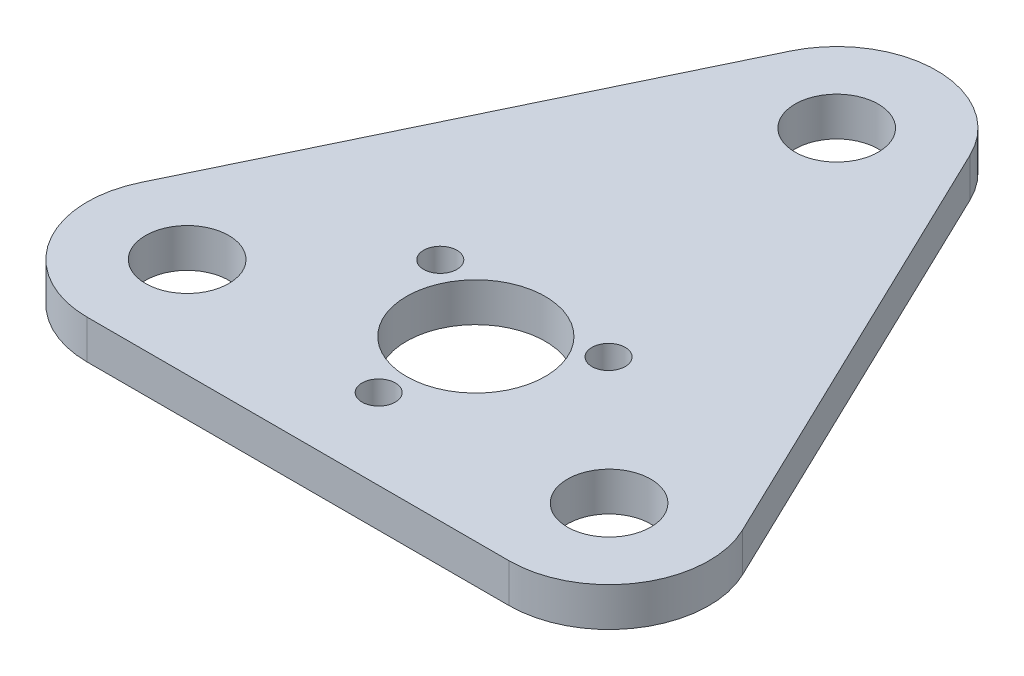
ISO-10303-21;
HEADER;
FILE_DESCRIPTION(('STEP AP214'),'2;1');
FILE_NAME('part.step','',(''),(''),'','','');
FILE_SCHEMA(('AUTOMOTIVE_DESIGN { 1 0 10303 214 1 1 1 1 }'));
ENDSEC;
DATA;
#1=APPLICATION_CONTEXT('core data for automotive mechanical design processes');
#2=APPLICATION_PROTOCOL_DEFINITION('international standard','automotive_design',2000,#1);
#3=PRODUCT_CONTEXT('',#1,'mechanical');
#4=PRODUCT('Part','Part','',(#3));
#5=PRODUCT_RELATED_PRODUCT_CATEGORY('part','',(#4));
#6=PRODUCT_DEFINITION_FORMATION('','',#4);
#7=PRODUCT_DEFINITION_CONTEXT('part definition',#1,'design');
#8=PRODUCT_DEFINITION('design','',#6,#7);
#9=PRODUCT_DEFINITION_SHAPE('','',#8);
#10=(LENGTH_UNIT() NAMED_UNIT(*) SI_UNIT(.MILLI.,.METRE.));
#11=(NAMED_UNIT(*) PLANE_ANGLE_UNIT() SI_UNIT($,.RADIAN.));
#12=(NAMED_UNIT(*) SI_UNIT($,.STERADIAN.) SOLID_ANGLE_UNIT());
#13=UNCERTAINTY_MEASURE_WITH_UNIT(LENGTH_MEASURE(1.E-05),#10,'distance_accuracy_value','');
#14=(GEOMETRIC_REPRESENTATION_CONTEXT(3) GLOBAL_UNCERTAINTY_ASSIGNED_CONTEXT((#13)) GLOBAL_UNIT_ASSIGNED_CONTEXT((#10,
#11,#12)) REPRESENTATION_CONTEXT('',''));
#15=CARTESIAN_POINT('',(0.,0.,0.));
#16=DIRECTION('',(0.,0.,1.));
#17=DIRECTION('',(1.,0.,0.));
#18=AXIS2_PLACEMENT_3D('',#15,#16,#17);
#19=CARTESIAN_POINT('',(-38.,3.5,0.));
#20=DIRECTION('',(0.,1.,0.));
#21=DIRECTION('',(0.,0.,1.));
#22=AXIS2_PLACEMENT_3D('',#19,#20,#21);
#23=PLANE('',#22);
#24=CARTESIAN_POINT('',(15.1554445662277,3.5,-22.7499999999999));
#25=DIRECTION('',(0.,1.,0.));
#26=DIRECTION('',(0.,0.,1.));
#27=AXIS2_PLACEMENT_3D('',#24,#25,#26);
#28=CIRCLE('',#27,3.);
#29=CARTESIAN_POINT('',(15.1554445662277,3.5,-19.7499999999999));
#30=VERTEX_POINT('',#29);
#31=EDGE_CURVE('E205',#30,#30,#28,.T.);
#32=ORIENTED_EDGE('',*,*,#31,.F.);
#33=EDGE_LOOP('',(#32));
#34=FACE_BOUND('',#33,.T.);
#35=CARTESIAN_POINT('',(0.,3.5,-14.));
#36=DIRECTION('',(0.,1.,0.));
#37=DIRECTION('',(0.,0.,1.));
#38=AXIS2_PLACEMENT_3D('',#35,#36,#37);
#39=CIRCLE('',#38,12.5);
#40=CARTESIAN_POINT('',(0.,3.5,-1.49999999999998));
#41=VERTEX_POINT('',#40);
#42=EDGE_CURVE('E217',#41,#41,#39,.T.);
#43=ORIENTED_EDGE('',*,*,#42,.F.);
#44=EDGE_LOOP('',(#43));
#45=FACE_BOUND('',#44,.T.);
#46=CARTESIAN_POINT('',(0.,3.5,-79.));
#47=DIRECTION('',(0.,1.,0.));
#48=DIRECTION('',(0.,0.,1.));
#49=AXIS2_PLACEMENT_3D('',#46,#47,#48);
#50=CIRCLE('',#49,7.5);
#51=CARTESIAN_POINT('',(0.,3.5,-71.5));
#52=VERTEX_POINT('',#51);
#53=EDGE_CURVE('E229',#52,#52,#50,.T.);
#54=ORIENTED_EDGE('',*,*,#53,.F.);
#55=EDGE_LOOP('',(#54));
#56=FACE_BOUND('',#55,.T.);
#57=CARTESIAN_POINT('',(-38.,3.5,0.));
#58=DIRECTION('',(0.,1.,0.));
#59=DIRECTION('',(0.,0.,1.));
#60=AXIS2_PLACEMENT_3D('',#57,#58,#59);
#61=CIRCLE('',#60,18.);
#62=CARTESIAN_POINT('',(-54.2210013513531,3.5,-7.80250697913184));
#63=VERTEX_POINT('',#62);
#64=CARTESIAN_POINT('',(-38.,3.5,18.));
#65=VERTEX_POINT('',#64);
#66=EDGE_CURVE('E132',#63,#65,#61,.T.);
#67=ORIENTED_EDGE('',*,*,#66,.T.);
#68=DIRECTION('',(1.,0.,0.));
#69=VECTOR('',#68,1.);
#70=CARTESIAN_POINT('',(-38.,3.5,18.));
#71=LINE('',#70,#69);
#72=CARTESIAN_POINT('',(38.,3.5,18.));
#73=VERTEX_POINT('',#72);
#74=EDGE_CURVE('E90',#65,#73,#71,.T.);
#75=ORIENTED_EDGE('',*,*,#74,.T.);
#76=CARTESIAN_POINT('',(38.,3.5,0.));
#77=DIRECTION('',(0.,1.,0.));
#78=DIRECTION('',(0.,0.,1.));
#79=AXIS2_PLACEMENT_3D('',#76,#77,#78);
#80=CIRCLE('',#79,18.);
#81=CARTESIAN_POINT('',(54.2210013513531,3.5,-7.80250697913184));
#82=VERTEX_POINT('',#81);
#83=EDGE_CURVE('E103',#73,#82,#80,.T.);
#84=ORIENTED_EDGE('',*,*,#83,.T.);
#85=DIRECTION('',(-0.43347260995177,0.,-0.901166741741838));
#86=VECTOR('',#85,1.);
#87=CARTESIAN_POINT('',(16.2210013513531,3.5,-86.8025069791318));
#88=LINE('',#87,#86);
#89=CARTESIAN_POINT('',(16.2210013513531,3.5,-86.8025069791318));
#90=VERTEX_POINT('',#89);
#91=EDGE_CURVE('E97',#82,#90,#88,.T.);
#92=ORIENTED_EDGE('',*,*,#91,.T.);
#93=CARTESIAN_POINT('',(0.,3.5,-79.));
#94=DIRECTION('',(0.,1.,0.));
#95=DIRECTION('',(0.,0.,1.));
#96=AXIS2_PLACEMENT_3D('',#93,#94,#95);
#97=CIRCLE('',#96,18.);
#98=CARTESIAN_POINT('',(-16.2210013513531,3.5,-86.8025069791318));
#99=VERTEX_POINT('',#98);
#100=EDGE_CURVE('E101',#90,#99,#97,.T.);
#101=ORIENTED_EDGE('',*,*,#100,.T.);
#102=DIRECTION('',(-0.43347260995177,0.,0.901166741741838));
#103=VECTOR('',#102,1.);
#104=CARTESIAN_POINT('',(-54.2210013513531,3.5,-7.80250697913184));
#105=LINE('',#104,#103);
#106=EDGE_CURVE('E53',#99,#63,#105,.T.);
#107=ORIENTED_EDGE('',*,*,#106,.T.);
#108=EDGE_LOOP('',(#67,#75,#84,#92,#101,#107));
#109=FACE_BOUND('',#108,.T.);
#110=CARTESIAN_POINT('',(-38.,3.5,0.));
#111=DIRECTION('',(0.,1.,0.));
#112=DIRECTION('',(0.,0.,1.));
#113=AXIS2_PLACEMENT_3D('',#110,#111,#112);
#114=CIRCLE('',#113,7.5);
#115=CARTESIAN_POINT('',(-38.,3.5,7.50000000000003));
#116=VERTEX_POINT('',#115);
#117=EDGE_CURVE('E125',#116,#116,#114,.T.);
#118=ORIENTED_EDGE('',*,*,#117,.F.);
#119=EDGE_LOOP('',(#118));
#120=FACE_BOUND('',#119,.T.);
#121=CARTESIAN_POINT('',(38.,3.5,0.));
#122=DIRECTION('',(0.,1.,0.));
#123=DIRECTION('',(0.,0.,1.));
#124=AXIS2_PLACEMENT_3D('',#121,#122,#123);
#125=CIRCLE('',#124,7.5);
#126=CARTESIAN_POINT('',(38.,3.5,7.50000000000002));
#127=VERTEX_POINT('',#126);
#128=EDGE_CURVE('E223',#127,#127,#125,.T.);
#129=ORIENTED_EDGE('',*,*,#128,.F.);
#130=EDGE_LOOP('',(#129));
#131=FACE_BOUND('',#130,.T.);
#132=CARTESIAN_POINT('',(-15.1554445662277,3.5,-22.7499999999999));
#133=DIRECTION('',(0.,1.,0.));
#134=DIRECTION('',(0.,0.,1.));
#135=AXIS2_PLACEMENT_3D('',#132,#133,#134);
#136=CIRCLE('',#135,3.);
#137=CARTESIAN_POINT('',(-15.1554445662277,3.5,-19.7499999999999));
#138=VERTEX_POINT('',#137);
#139=EDGE_CURVE('E211',#138,#138,#136,.T.);
#140=ORIENTED_EDGE('',*,*,#139,.F.);
#141=EDGE_LOOP('',(#140));
#142=FACE_BOUND('',#141,.T.);
#143=CARTESIAN_POINT('',(0.,3.5,3.50000000000002));
#144=DIRECTION('',(0.,1.,0.));
#145=DIRECTION('',(0.,0.,1.));
#146=AXIS2_PLACEMENT_3D('',#143,#144,#145);
#147=CIRCLE('',#146,3.);
#148=CARTESIAN_POINT('',(0.,3.5,6.50000000000002));
#149=VERTEX_POINT('',#148);
#150=EDGE_CURVE('E196',#149,#149,#147,.T.);
#151=ORIENTED_EDGE('',*,*,#150,.F.);
#152=EDGE_LOOP('',(#151));
#153=FACE_BOUND('',#152,.T.);
#154=ADVANCED_FACE('F36',(#34,#45,#56,#109,#120,#131,#142,#153),#23,.T.);
#155=CARTESIAN_POINT('',(-38.,-3.5,0.));
#156=DIRECTION('',(0.,1.,0.));
#157=DIRECTION('',(0.,0.,1.));
#158=AXIS2_PLACEMENT_3D('',#155,#156,#157);
#159=PLANE('',#158);
#160=CARTESIAN_POINT('',(15.1554445662277,-3.5,-22.7499999999999));
#161=DIRECTION('',(0.,1.,0.));
#162=DIRECTION('',(0.,0.,1.));
#163=AXIS2_PLACEMENT_3D('',#160,#161,#162);
#164=CIRCLE('',#163,3.);
#165=CARTESIAN_POINT('',(15.1554445662277,-3.5,-19.7499999999999));
#166=VERTEX_POINT('',#165);
#167=EDGE_CURVE('E202',#166,#166,#164,.T.);
#168=ORIENTED_EDGE('',*,*,#167,.T.);
#169=EDGE_LOOP('',(#168));
#170=FACE_BOUND('',#169,.T.);
#171=CARTESIAN_POINT('',(0.,-3.5,-14.));
#172=DIRECTION('',(0.,1.,0.));
#173=DIRECTION('',(0.,0.,1.));
#174=AXIS2_PLACEMENT_3D('',#171,#172,#173);
#175=CIRCLE('',#174,12.5);
#176=CARTESIAN_POINT('',(0.,-3.5,-1.49999999999998));
#177=VERTEX_POINT('',#176);
#178=EDGE_CURVE('E214',#177,#177,#175,.T.);
#179=ORIENTED_EDGE('',*,*,#178,.T.);
#180=EDGE_LOOP('',(#179));
#181=FACE_BOUND('',#180,.T.);
#182=CARTESIAN_POINT('',(0.,-3.5,-79.));
#183=DIRECTION('',(0.,1.,0.));
#184=DIRECTION('',(0.,0.,1.));
#185=AXIS2_PLACEMENT_3D('',#182,#183,#184);
#186=CIRCLE('',#185,7.5);
#187=CARTESIAN_POINT('',(0.,-3.5,-71.5));
#188=VERTEX_POINT('',#187);
#189=EDGE_CURVE('E226',#188,#188,#186,.T.);
#190=ORIENTED_EDGE('',*,*,#189,.T.);
#191=EDGE_LOOP('',(#190));
#192=FACE_BOUND('',#191,.T.);
#193=CARTESIAN_POINT('',(-38.,-3.5,0.));
#194=DIRECTION('',(0.,1.,0.));
#195=DIRECTION('',(0.,0.,1.));
#196=AXIS2_PLACEMENT_3D('',#193,#194,#195);
#197=CIRCLE('',#196,18.);
#198=CARTESIAN_POINT('',(-54.2210013513531,-3.5,-7.80250697913184));
#199=VERTEX_POINT('',#198);
#200=CARTESIAN_POINT('',(-38.,-3.5,18.));
#201=VERTEX_POINT('',#200);
#202=EDGE_CURVE('E121',#199,#201,#197,.T.);
#203=ORIENTED_EDGE('',*,*,#202,.F.);
#204=DIRECTION('',(-0.43347260995177,0.,0.901166741741838));
#205=VECTOR('',#204,1.);
#206=CARTESIAN_POINT('',(-54.2210013513531,-3.5,-7.80250697913184));
#207=LINE('',#206,#205);
#208=CARTESIAN_POINT('',(-16.2210013513531,-3.5,-86.8025069791318));
#209=VERTEX_POINT('',#208);
#210=EDGE_CURVE('E82',#209,#199,#207,.T.);
#211=ORIENTED_EDGE('',*,*,#210,.F.);
#212=CARTESIAN_POINT('',(0.,-3.5,-79.));
#213=DIRECTION('',(0.,1.,0.));
#214=DIRECTION('',(0.,0.,1.));
#215=AXIS2_PLACEMENT_3D('',#212,#213,#214);
#216=CIRCLE('',#215,18.);
#217=CARTESIAN_POINT('',(16.2210013513531,-3.5,-86.8025069791318));
#218=VERTEX_POINT('',#217);
#219=EDGE_CURVE('E76',#218,#209,#216,.T.);
#220=ORIENTED_EDGE('',*,*,#219,.F.);
#221=DIRECTION('',(-0.43347260995177,0.,-0.901166741741838));
#222=VECTOR('',#221,1.);
#223=CARTESIAN_POINT('',(16.2210013513531,-3.5,-86.8025069791318));
#224=LINE('',#223,#222);
#225=CARTESIAN_POINT('',(54.2210013513531,-3.5,-7.80250697913184));
#226=VERTEX_POINT('',#225);
#227=EDGE_CURVE('E111',#226,#218,#224,.T.);
#228=ORIENTED_EDGE('',*,*,#227,.F.);
#229=CARTESIAN_POINT('',(38.,-3.5,0.));
#230=DIRECTION('',(0.,1.,0.));
#231=DIRECTION('',(0.,0.,1.));
#232=AXIS2_PLACEMENT_3D('',#229,#230,#231);
#233=CIRCLE('',#232,18.);
#234=CARTESIAN_POINT('',(38.,-3.5,18.));
#235=VERTEX_POINT('',#234);
#236=EDGE_CURVE('E127',#235,#226,#233,.T.);
#237=ORIENTED_EDGE('',*,*,#236,.F.);
#238=DIRECTION('',(1.,0.,0.));
#239=VECTOR('',#238,1.);
#240=CARTESIAN_POINT('',(-38.,-3.5,18.));
#241=LINE('',#240,#239);
#242=EDGE_CURVE('E124',#201,#235,#241,.T.);
#243=ORIENTED_EDGE('',*,*,#242,.F.);
#244=EDGE_LOOP('',(#203,#211,#220,#228,#237,#243));
#245=FACE_BOUND('',#244,.T.);
#246=CARTESIAN_POINT('',(-38.,-3.5,0.));
#247=DIRECTION('',(0.,1.,0.));
#248=DIRECTION('',(0.,0.,1.));
#249=AXIS2_PLACEMENT_3D('',#246,#247,#248);
#250=CIRCLE('',#249,7.5);
#251=CARTESIAN_POINT('',(-38.,-3.5,7.50000000000003));
#252=VERTEX_POINT('',#251);
#253=EDGE_CURVE('E232',#252,#252,#250,.T.);
#254=ORIENTED_EDGE('',*,*,#253,.T.);
#255=EDGE_LOOP('',(#254));
#256=FACE_BOUND('',#255,.T.);
#257=CARTESIAN_POINT('',(38.,-3.5,0.));
#258=DIRECTION('',(0.,1.,0.));
#259=DIRECTION('',(0.,0.,1.));
#260=AXIS2_PLACEMENT_3D('',#257,#258,#259);
#261=CIRCLE('',#260,7.5);
#262=CARTESIAN_POINT('',(38.,-3.5,7.50000000000002));
#263=VERTEX_POINT('',#262);
#264=EDGE_CURVE('E220',#263,#263,#261,.T.);
#265=ORIENTED_EDGE('',*,*,#264,.T.);
#266=EDGE_LOOP('',(#265));
#267=FACE_BOUND('',#266,.T.);
#268=CARTESIAN_POINT('',(-15.1554445662277,-3.5,-22.7499999999999));
#269=DIRECTION('',(0.,1.,0.));
#270=DIRECTION('',(0.,0.,1.));
#271=AXIS2_PLACEMENT_3D('',#268,#269,#270);
#272=CIRCLE('',#271,3.);
#273=CARTESIAN_POINT('',(-15.1554445662277,-3.5,-19.7499999999999));
#274=VERTEX_POINT('',#273);
#275=EDGE_CURVE('E208',#274,#274,#272,.T.);
#276=ORIENTED_EDGE('',*,*,#275,.T.);
#277=EDGE_LOOP('',(#276));
#278=FACE_BOUND('',#277,.T.);
#279=CARTESIAN_POINT('',(0.,-3.5,3.50000000000002));
#280=DIRECTION('',(0.,1.,0.));
#281=DIRECTION('',(0.,0.,1.));
#282=AXIS2_PLACEMENT_3D('',#279,#280,#281);
#283=CIRCLE('',#282,3.);
#284=CARTESIAN_POINT('',(0.,-3.5,6.50000000000002));
#285=VERTEX_POINT('',#284);
#286=EDGE_CURVE('E199',#285,#285,#283,.T.);
#287=ORIENTED_EDGE('',*,*,#286,.T.);
#288=EDGE_LOOP('',(#287));
#289=FACE_BOUND('',#288,.T.);
#290=ADVANCED_FACE('F141',(#170,#181,#192,#245,#256,#267,#278,#289),#159,.F.);
#291=CARTESIAN_POINT('',(-38.,3.5,0.));
#292=DIRECTION('',(0.,-1.,0.));
#293=DIRECTION('',(0.,0.,-1.));
#294=AXIS2_PLACEMENT_3D('',#291,#292,#293);
#295=CYLINDRICAL_SURFACE('',#294,18.);
#296=ORIENTED_EDGE('',*,*,#202,.T.);
#297=DIRECTION('',(0.,-1.,0.));
#298=VECTOR('',#297,1.);
#299=CARTESIAN_POINT('',(-38.,3.5,18.));
#300=LINE('',#299,#298);
#301=EDGE_CURVE('E11',#65,#201,#300,.T.);
#302=ORIENTED_EDGE('',*,*,#301,.F.);
#303=ORIENTED_EDGE('',*,*,#66,.F.);
#304=DIRECTION('',(0.,-1.,0.));
#305=VECTOR('',#304,1.);
#306=CARTESIAN_POINT('',(-54.2210013513531,3.5,-7.80250697913184));
#307=LINE('',#306,#305);
#308=EDGE_CURVE('E117',#63,#199,#307,.T.);
#309=ORIENTED_EDGE('',*,*,#308,.T.);
#310=EDGE_LOOP('',(#296,#302,#303,#309));
#311=FACE_BOUND('',#310,.T.);
#312=ADVANCED_FACE('F38',(#311),#295,.T.);
#313=CARTESIAN_POINT('',(-38.,3.5,18.));
#314=DIRECTION('',(0.,0.,-1.));
#315=DIRECTION('',(-1.,0.,0.));
#316=AXIS2_PLACEMENT_3D('',#313,#314,#315);
#317=PLANE('',#316);
#318=ORIENTED_EDGE('',*,*,#242,.T.);
#319=DIRECTION('',(0.,-1.,0.));
#320=VECTOR('',#319,1.);
#321=CARTESIAN_POINT('',(38.,3.5,18.));
#322=LINE('',#321,#320);
#323=EDGE_CURVE('E45',#73,#235,#322,.T.);
#324=ORIENTED_EDGE('',*,*,#323,.F.);
#325=ORIENTED_EDGE('',*,*,#74,.F.);
#326=ORIENTED_EDGE('',*,*,#301,.T.);
#327=EDGE_LOOP('',(#318,#324,#325,#326));
#328=FACE_BOUND('',#327,.T.);
#329=ADVANCED_FACE('F334',(#328),#317,.F.);
#330=CARTESIAN_POINT('',(38.,3.5,0.));
#331=DIRECTION('',(0.,-1.,0.));
#332=DIRECTION('',(0.,0.,-1.));
#333=AXIS2_PLACEMENT_3D('',#330,#331,#332);
#334=CYLINDRICAL_SURFACE('',#333,18.);
#335=ORIENTED_EDGE('',*,*,#236,.T.);
#336=DIRECTION('',(0.,-1.,0.));
#337=VECTOR('',#336,1.);
#338=CARTESIAN_POINT('',(54.2210013513531,3.5,-7.80250697913184));
#339=LINE('',#338,#337);
#340=EDGE_CURVE('E112',#82,#226,#339,.T.);
#341=ORIENTED_EDGE('',*,*,#340,.F.);
#342=ORIENTED_EDGE('',*,*,#83,.F.);
#343=ORIENTED_EDGE('',*,*,#323,.T.);
#344=EDGE_LOOP('',(#335,#341,#342,#343));
#345=FACE_BOUND('',#344,.T.);
#346=ADVANCED_FACE('F138',(#345),#334,.T.);
#347=CARTESIAN_POINT('',(16.2210013513531,3.5,-86.8025069791318));
#348=DIRECTION('',(-0.901166741741838,0.,0.43347260995177));
#349=DIRECTION('',(0.43347260995177,0.,0.901166741741838));
#350=AXIS2_PLACEMENT_3D('',#347,#348,#349);
#351=PLANE('',#350);
#352=ORIENTED_EDGE('',*,*,#227,.T.);
#353=DIRECTION('',(0.,-1.,0.));
#354=VECTOR('',#353,1.);
#355=CARTESIAN_POINT('',(16.2210013513531,3.5,-86.8025069791318));
#356=LINE('',#355,#354);
#357=EDGE_CURVE('E108',#90,#218,#356,.T.);
#358=ORIENTED_EDGE('',*,*,#357,.F.);
#359=ORIENTED_EDGE('',*,*,#91,.F.);
#360=ORIENTED_EDGE('',*,*,#340,.T.);
#361=EDGE_LOOP('',(#352,#358,#359,#360));
#362=FACE_BOUND('',#361,.T.);
#363=ADVANCED_FACE('F109',(#362),#351,.F.);
#364=CARTESIAN_POINT('',(0.,3.5,-79.));
#365=DIRECTION('',(0.,-1.,0.));
#366=DIRECTION('',(0.,0.,-1.));
#367=AXIS2_PLACEMENT_3D('',#364,#365,#366);
#368=CYLINDRICAL_SURFACE('',#367,18.);
#369=ORIENTED_EDGE('',*,*,#219,.T.);
#370=DIRECTION('',(0.,-1.,0.));
#371=VECTOR('',#370,1.);
#372=CARTESIAN_POINT('',(-16.2210013513531,3.5,-86.8025069791318));
#373=LINE('',#372,#371);
#374=EDGE_CURVE('E113',#99,#209,#373,.T.);
#375=ORIENTED_EDGE('',*,*,#374,.F.);
#376=ORIENTED_EDGE('',*,*,#100,.F.);
#377=ORIENTED_EDGE('',*,*,#357,.T.);
#378=EDGE_LOOP('',(#369,#375,#376,#377));
#379=FACE_BOUND('',#378,.T.);
#380=ADVANCED_FACE('F115',(#379),#368,.T.);
#381=CARTESIAN_POINT('',(-54.2210013513531,3.5,-7.80250697913184));
#382=DIRECTION('',(0.901166741741838,0.,0.43347260995177));
#383=DIRECTION('',(0.43347260995177,0.,-0.901166741741838));
#384=AXIS2_PLACEMENT_3D('',#381,#382,#383);
#385=PLANE('',#384);
#386=ORIENTED_EDGE('',*,*,#210,.T.);
#387=ORIENTED_EDGE('',*,*,#308,.F.);
#388=ORIENTED_EDGE('',*,*,#106,.F.);
#389=ORIENTED_EDGE('',*,*,#374,.T.);
#390=EDGE_LOOP('',(#386,#387,#388,#389));
#391=FACE_BOUND('',#390,.T.);
#392=ADVANCED_FACE('F146',(#391),#385,.F.);
#393=CARTESIAN_POINT('',(-38.,3.5,0.));
#394=DIRECTION('',(0.,-1.,0.));
#395=DIRECTION('',(0.,0.,-1.));
#396=AXIS2_PLACEMENT_3D('',#393,#394,#395);
#397=CYLINDRICAL_SURFACE('',#396,7.5);
#398=ORIENTED_EDGE('',*,*,#117,.T.);
#399=EDGE_LOOP('',(#398));
#400=FACE_BOUND('',#399,.T.);
#401=ORIENTED_EDGE('',*,*,#253,.F.);
#402=EDGE_LOOP('',(#401));
#403=FACE_BOUND('',#402,.T.);
#404=ADVANCED_FACE('F148',(#400,#403),#397,.F.);
#405=CARTESIAN_POINT('',(0.,3.5,-79.));
#406=DIRECTION('',(0.,-1.,0.));
#407=DIRECTION('',(0.,0.,-1.));
#408=AXIS2_PLACEMENT_3D('',#405,#406,#407);
#409=CYLINDRICAL_SURFACE('',#408,7.5);
#410=ORIENTED_EDGE('',*,*,#53,.T.);
#411=EDGE_LOOP('',(#410));
#412=FACE_BOUND('',#411,.T.);
#413=ORIENTED_EDGE('',*,*,#189,.F.);
#414=EDGE_LOOP('',(#413));
#415=FACE_BOUND('',#414,.T.);
#416=ADVANCED_FACE('F154',(#412,#415),#409,.F.);
#417=CARTESIAN_POINT('',(38.,3.5,0.));
#418=DIRECTION('',(0.,-1.,0.));
#419=DIRECTION('',(0.,0.,-1.));
#420=AXIS2_PLACEMENT_3D('',#417,#418,#419);
#421=CYLINDRICAL_SURFACE('',#420,7.5);
#422=ORIENTED_EDGE('',*,*,#128,.T.);
#423=EDGE_LOOP('',(#422));
#424=FACE_BOUND('',#423,.T.);
#425=ORIENTED_EDGE('',*,*,#264,.F.);
#426=EDGE_LOOP('',(#425));
#427=FACE_BOUND('',#426,.T.);
#428=ADVANCED_FACE('F171',(#424,#427),#421,.F.);
#429=CARTESIAN_POINT('',(0.,3.5,-14.));
#430=DIRECTION('',(0.,-1.,0.));
#431=DIRECTION('',(0.,0.,-1.));
#432=AXIS2_PLACEMENT_3D('',#429,#430,#431);
#433=CYLINDRICAL_SURFACE('',#432,12.5);
#434=ORIENTED_EDGE('',*,*,#42,.T.);
#435=EDGE_LOOP('',(#434));
#436=FACE_BOUND('',#435,.T.);
#437=ORIENTED_EDGE('',*,*,#178,.F.);
#438=EDGE_LOOP('',(#437));
#439=FACE_BOUND('',#438,.T.);
#440=ADVANCED_FACE('F175',(#436,#439),#433,.F.);
#441=CARTESIAN_POINT('',(-15.1554445662277,3.5,-22.7499999999999));
#442=DIRECTION('',(0.,-1.,0.));
#443=DIRECTION('',(0.,0.,-1.));
#444=AXIS2_PLACEMENT_3D('',#441,#442,#443);
#445=CYLINDRICAL_SURFACE('',#444,3.);
#446=ORIENTED_EDGE('',*,*,#139,.T.);
#447=EDGE_LOOP('',(#446));
#448=FACE_BOUND('',#447,.T.);
#449=ORIENTED_EDGE('',*,*,#275,.F.);
#450=EDGE_LOOP('',(#449));
#451=FACE_BOUND('',#450,.T.);
#452=ADVANCED_FACE('F179',(#448,#451),#445,.F.);
#453=CARTESIAN_POINT('',(15.1554445662277,3.5,-22.7499999999999));
#454=DIRECTION('',(0.,-1.,0.));
#455=DIRECTION('',(0.,0.,-1.));
#456=AXIS2_PLACEMENT_3D('',#453,#454,#455);
#457=CYLINDRICAL_SURFACE('',#456,3.);
#458=ORIENTED_EDGE('',*,*,#31,.T.);
#459=EDGE_LOOP('',(#458));
#460=FACE_BOUND('',#459,.T.);
#461=ORIENTED_EDGE('',*,*,#167,.F.);
#462=EDGE_LOOP('',(#461));
#463=FACE_BOUND('',#462,.T.);
#464=ADVANCED_FACE('F183',(#460,#463),#457,.F.);
#465=CARTESIAN_POINT('',(0.,3.5,3.50000000000002));
#466=DIRECTION('',(0.,-1.,0.));
#467=DIRECTION('',(0.,0.,-1.));
#468=AXIS2_PLACEMENT_3D('',#465,#466,#467);
#469=CYLINDRICAL_SURFACE('',#468,3.);
#470=ORIENTED_EDGE('',*,*,#150,.T.);
#471=EDGE_LOOP('',(#470));
#472=FACE_BOUND('',#471,.T.);
#473=ORIENTED_EDGE('',*,*,#286,.F.);
#474=EDGE_LOOP('',(#473));
#475=FACE_BOUND('',#474,.T.);
#476=ADVANCED_FACE('F187',(#472,#475),#469,.F.);
#477=CLOSED_SHELL('',(#154,#290,#312,#329,#346,#363,#380,#392,#404,#416,#428,#440,#452,#464,#476));
#478=MANIFOLD_SOLID_BREP('B2',#477);
#479=ADVANCED_BREP_SHAPE_REPRESENTATION('',(#18,#478),#14);
#480=SHAPE_DEFINITION_REPRESENTATION(#9,#479);
ENDSEC;
END-ISO-10303-21;
